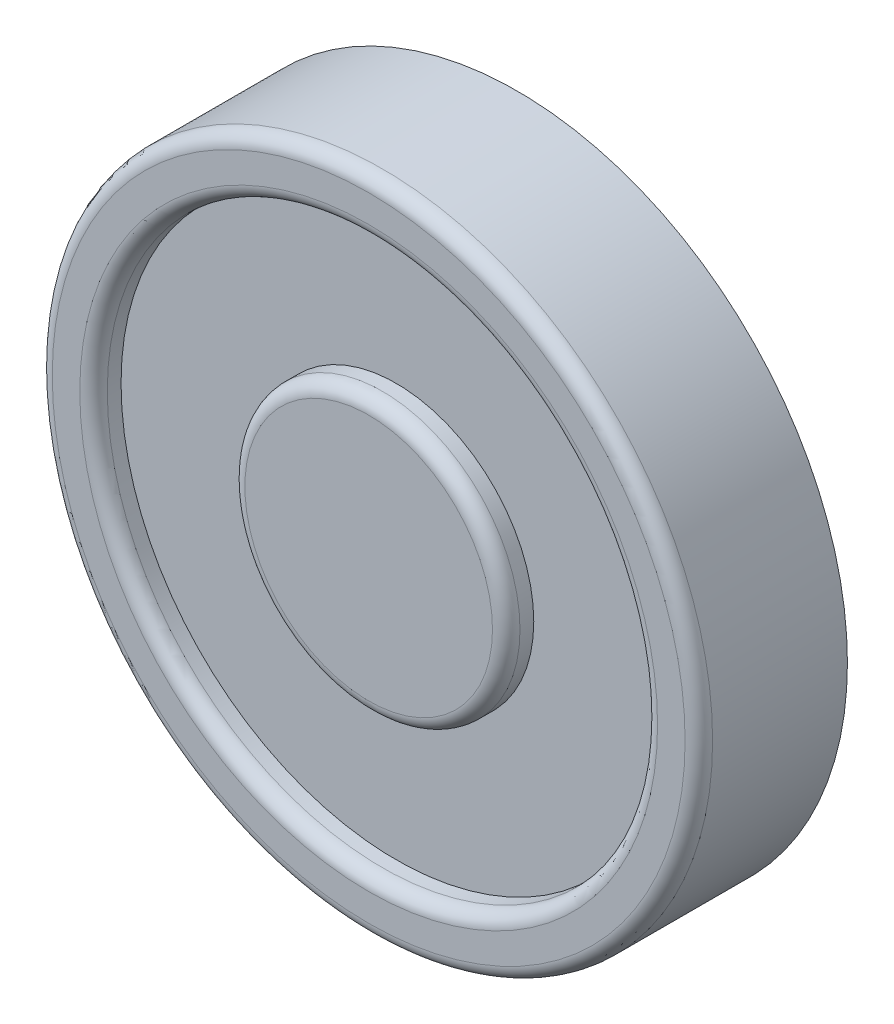
ISO-10303-21;
HEADER;
FILE_DESCRIPTION(('STEP AP214'),'2;1');
FILE_NAME('part.step','',(''),(''),'','','');
FILE_SCHEMA(('AUTOMOTIVE_DESIGN { 1 0 10303 214 1 1 1 1 }'));
ENDSEC;
DATA;
#1=APPLICATION_CONTEXT('core data for automotive mechanical design processes');
#2=APPLICATION_PROTOCOL_DEFINITION('international standard','automotive_design',2000,#1);
#3=PRODUCT_CONTEXT('',#1,'mechanical');
#4=PRODUCT('Part','Part','',(#3));
#5=PRODUCT_RELATED_PRODUCT_CATEGORY('part','',(#4));
#6=PRODUCT_DEFINITION_FORMATION('','',#4);
#7=PRODUCT_DEFINITION_CONTEXT('part definition',#1,'design');
#8=PRODUCT_DEFINITION('design','',#6,#7);
#9=PRODUCT_DEFINITION_SHAPE('','',#8);
#10=(LENGTH_UNIT() NAMED_UNIT(*) SI_UNIT(.MILLI.,.METRE.));
#11=(NAMED_UNIT(*) PLANE_ANGLE_UNIT() SI_UNIT($,.RADIAN.));
#12=(NAMED_UNIT(*) SI_UNIT($,.STERADIAN.) SOLID_ANGLE_UNIT());
#13=UNCERTAINTY_MEASURE_WITH_UNIT(LENGTH_MEASURE(1.E-05),#10,'distance_accuracy_value','');
#14=(GEOMETRIC_REPRESENTATION_CONTEXT(3) GLOBAL_UNCERTAINTY_ASSIGNED_CONTEXT((#13)) GLOBAL_UNIT_ASSIGNED_CONTEXT((#10,
#11,#12)) REPRESENTATION_CONTEXT('',''));
#15=CARTESIAN_POINT('',(0.,0.,0.));
#16=DIRECTION('',(0.,0.,1.));
#17=DIRECTION('',(1.,0.,0.));
#18=AXIS2_PLACEMENT_3D('',#15,#16,#17);
#19=CARTESIAN_POINT('',(-2.62789909595795,3.37216422453345,1.08));
#20=DIRECTION('',(0.,0.,-1.));
#21=DIRECTION('',(-1.,0.,0.));
#22=AXIS2_PLACEMENT_3D('',#19,#20,#21);
#23=CYLINDRICAL_SURFACE('',#22,2.4);
#24=CARTESIAN_POINT('',(-2.62789909595795,3.37216422453345,0.98));
#25=DIRECTION('',(0.,0.,1.));
#26=DIRECTION('',(1.,0.,0.));
#27=AXIS2_PLACEMENT_3D('',#24,#25,#26);
#28=CIRCLE('',#27,2.4);
#29=CARTESIAN_POINT('',(-0.227899095957949,3.37216422453345,0.98));
#30=VERTEX_POINT('',#29);
#31=EDGE_CURVE('E39',#30,#30,#28,.F.);
#32=ORIENTED_EDGE('',*,*,#31,.T.);
#33=EDGE_LOOP('',(#32));
#34=FACE_BOUND('',#33,.T.);
#35=CARTESIAN_POINT('',(-2.62789909595795,3.37216422453345,0.));
#36=DIRECTION('',(0.,0.,1.));
#37=DIRECTION('',(1.,0.,0.));
#38=AXIS2_PLACEMENT_3D('',#35,#36,#37);
#39=CIRCLE('',#38,2.4);
#40=CARTESIAN_POINT('',(-0.227899095957949,3.37216422453345,0.));
#41=VERTEX_POINT('',#40);
#42=EDGE_CURVE('E58',#41,#41,#39,.T.);
#43=ORIENTED_EDGE('',*,*,#42,.T.);
#44=EDGE_LOOP('',(#43));
#45=FACE_BOUND('',#44,.T.);
#46=ADVANCED_FACE('F32',(#34,#45),#23,.T.);
#47=CARTESIAN_POINT('',(-2.62789909595795,3.37216422453345,1.08));
#48=DIRECTION('',(0.,0.,1.));
#49=DIRECTION('',(1.,0.,0.));
#50=AXIS2_PLACEMENT_3D('',#47,#48,#49);
#51=PLANE('',#50);
#52=CARTESIAN_POINT('',(-2.62789909595795,3.37216422453345,1.08));
#53=DIRECTION('',(0.,0.,1.));
#54=DIRECTION('',(1.,0.,0.));
#55=AXIS2_PLACEMENT_3D('',#52,#53,#54);
#56=CIRCLE('',#55,2.3);
#57=CARTESIAN_POINT('',(-0.327899095957949,3.37216422453345,1.08));
#58=VERTEX_POINT('',#57);
#59=EDGE_CURVE('E43',#58,#58,#56,.T.);
#60=ORIENTED_EDGE('',*,*,#59,.T.);
#61=EDGE_LOOP('',(#60));
#62=FACE_BOUND('',#61,.T.);
#63=CARTESIAN_POINT('',(-2.62789909595795,3.37216422453345,1.08));
#64=DIRECTION('',(0.,0.,1.));
#65=DIRECTION('',(1.,0.,0.));
#66=AXIS2_PLACEMENT_3D('',#63,#64,#65);
#67=CIRCLE('',#66,2.1);
#68=CARTESIAN_POINT('',(-0.527899095957949,3.37216422453345,1.08));
#69=VERTEX_POINT('',#68);
#70=EDGE_CURVE('E47',#69,#69,#67,.F.);
#71=ORIENTED_EDGE('',*,*,#70,.T.);
#72=EDGE_LOOP('',(#71));
#73=FACE_BOUND('',#72,.T.);
#74=ADVANCED_FACE('F86',(#62,#73),#51,.T.);
#75=CARTESIAN_POINT('',(-2.62789909595795,3.37216422453345,0.));
#76=DIRECTION('',(0.,0.,1.));
#77=DIRECTION('',(1.,0.,0.));
#78=AXIS2_PLACEMENT_3D('',#75,#76,#77);
#79=PLANE('',#78);
#80=CARTESIAN_POINT('',(-2.62789909595795,3.37216422453345,0.));
#81=DIRECTION('',(0.,0.,-1.));
#82=DIRECTION('',(-1.,0.,0.));
#83=AXIS2_PLACEMENT_3D('',#80,#81,#82);
#84=CIRCLE('',#83,0.5);
#85=CARTESIAN_POINT('',(-3.12789909595795,3.37216422453345,0.));
#86=VERTEX_POINT('',#85);
#87=EDGE_CURVE('E68',#86,#86,#84,.T.);
#88=ORIENTED_EDGE('',*,*,#87,.F.);
#89=EDGE_LOOP('',(#88));
#90=FACE_BOUND('',#89,.T.);
#91=ORIENTED_EDGE('',*,*,#42,.F.);
#92=EDGE_LOOP('',(#91));
#93=FACE_BOUND('',#92,.T.);
#94=ADVANCED_FACE('F82',(#90,#93),#79,.F.);
#95=CARTESIAN_POINT('',(-2.62789909595795,3.37216422453345,0.88));
#96=DIRECTION('',(0.,0.,1.));
#97=DIRECTION('',(1.,0.,0.));
#98=AXIS2_PLACEMENT_3D('',#95,#96,#97);
#99=CYLINDRICAL_SURFACE('',#98,2.);
#100=CARTESIAN_POINT('',(-2.62789909595795,3.37216422453345,0.98));
#101=DIRECTION('',(0.,0.,1.));
#102=DIRECTION('',(1.,0.,0.));
#103=AXIS2_PLACEMENT_3D('',#100,#101,#102);
#104=CIRCLE('',#103,2.);
#105=CARTESIAN_POINT('',(-0.627899095957949,3.37216422453345,0.98));
#106=VERTEX_POINT('',#105);
#107=EDGE_CURVE('E10',#106,#106,#104,.T.);
#108=ORIENTED_EDGE('',*,*,#107,.T.);
#109=EDGE_LOOP('',(#108));
#110=FACE_BOUND('',#109,.T.);
#111=CARTESIAN_POINT('',(-2.62789909595795,3.37216422453345,0.88));
#112=DIRECTION('',(0.,0.,1.));
#113=DIRECTION('',(1.,0.,0.));
#114=AXIS2_PLACEMENT_3D('',#111,#112,#113);
#115=CIRCLE('',#114,2.);
#116=CARTESIAN_POINT('',(-0.627899095957949,3.37216422453345,0.88));
#117=VERTEX_POINT('',#116);
#118=EDGE_CURVE('E61',#117,#117,#115,.T.);
#119=ORIENTED_EDGE('',*,*,#118,.F.);
#120=EDGE_LOOP('',(#119));
#121=FACE_BOUND('',#120,.T.);
#122=ADVANCED_FACE('F85',(#110,#121),#99,.F.);
#123=CARTESIAN_POINT('',(-2.62789909595795,3.37216422453345,0.88));
#124=DIRECTION('',(0.,0.,1.));
#125=DIRECTION('',(1.,0.,0.));
#126=AXIS2_PLACEMENT_3D('',#123,#124,#125);
#127=PLANE('',#126);
#128=CARTESIAN_POINT('',(-2.62789909595795,3.37216422453345,0.88));
#129=DIRECTION('',(0.,0.,1.));
#130=DIRECTION('',(1.,0.,0.));
#131=AXIS2_PLACEMENT_3D('',#128,#129,#130);
#132=CIRCLE('',#131,1.);
#133=CARTESIAN_POINT('',(-1.62789909595795,3.37216422453345,0.88));
#134=VERTEX_POINT('',#133);
#135=EDGE_CURVE('E64',#134,#134,#132,.T.);
#136=ORIENTED_EDGE('',*,*,#135,.F.);
#137=EDGE_LOOP('',(#136));
#138=FACE_BOUND('',#137,.T.);
#139=ORIENTED_EDGE('',*,*,#118,.T.);
#140=EDGE_LOOP('',(#139));
#141=FACE_BOUND('',#140,.T.);
#142=ADVANCED_FACE('F152',(#138,#141),#127,.T.);
#143=CARTESIAN_POINT('',(-2.62789909595795,3.37216422453345,0.88));
#144=DIRECTION('',(0.,0.,1.));
#145=DIRECTION('',(1.,0.,0.));
#146=AXIS2_PLACEMENT_3D('',#143,#144,#145);
#147=CYLINDRICAL_SURFACE('',#146,1.);
#148=CARTESIAN_POINT('',(-2.62789909595795,3.37216422453345,0.98));
#149=DIRECTION('',(0.,0.,1.));
#150=DIRECTION('',(1.,0.,0.));
#151=AXIS2_PLACEMENT_3D('',#148,#149,#150);
#152=CIRCLE('',#151,1.);
#153=CARTESIAN_POINT('',(-1.62789909595795,3.37216422453345,0.98));
#154=VERTEX_POINT('',#153);
#155=EDGE_CURVE('E52',#154,#154,#152,.F.);
#156=ORIENTED_EDGE('',*,*,#155,.T.);
#157=EDGE_LOOP('',(#156));
#158=FACE_BOUND('',#157,.T.);
#159=ORIENTED_EDGE('',*,*,#135,.T.);
#160=EDGE_LOOP('',(#159));
#161=FACE_BOUND('',#160,.T.);
#162=ADVANCED_FACE('F146',(#158,#161),#147,.T.);
#163=CARTESIAN_POINT('',(-2.62789909595795,3.37216422453345,1.08));
#164=DIRECTION('',(0.,0.,1.));
#165=DIRECTION('',(1.,0.,0.));
#166=AXIS2_PLACEMENT_3D('',#163,#164,#165);
#167=CIRCLE('',#166,0.9);
#168=CARTESIAN_POINT('',(-1.72789909595795,3.37216422453345,1.08));
#169=VERTEX_POINT('',#168);
#170=EDGE_CURVE('E55',#169,#169,#167,.T.);
#171=ORIENTED_EDGE('',*,*,#170,.T.);
#172=EDGE_LOOP('',(#171));
#173=FACE_BOUND('',#172,.T.);
#174=ADVANCED_FACE('F97',(#173),#51,.T.);
#175=CARTESIAN_POINT('',(-2.62789909595795,3.37216422453345,0.98));
#176=DIRECTION('',(0.,0.,1.));
#177=DIRECTION('',(1.,0.,0.));
#178=AXIS2_PLACEMENT_3D('',#175,#176,#177);
#179=TOROIDAL_SURFACE('',#178,0.9,0.1);
#180=ORIENTED_EDGE('',*,*,#155,.F.);
#181=EDGE_LOOP('',(#180));
#182=FACE_BOUND('',#181,.T.);
#183=ORIENTED_EDGE('',*,*,#170,.F.);
#184=EDGE_LOOP('',(#183));
#185=FACE_BOUND('',#184,.T.);
#186=ADVANCED_FACE('F99',(#182,#185),#179,.T.);
#187=CARTESIAN_POINT('',(-2.62789909595795,3.37216422453345,0.98));
#188=DIRECTION('',(0.,0.,1.));
#189=DIRECTION('',(1.,0.,0.));
#190=AXIS2_PLACEMENT_3D('',#187,#188,#189);
#191=TOROIDAL_SURFACE('',#190,2.3,0.1);
#192=ORIENTED_EDGE('',*,*,#31,.F.);
#193=EDGE_LOOP('',(#192));
#194=FACE_BOUND('',#193,.T.);
#195=ORIENTED_EDGE('',*,*,#59,.F.);
#196=EDGE_LOOP('',(#195));
#197=FACE_BOUND('',#196,.T.);
#198=ADVANCED_FACE('F101',(#194,#197),#191,.T.);
#199=CARTESIAN_POINT('',(-2.62789909595795,3.37216422453345,0.98));
#200=DIRECTION('',(0.,0.,1.));
#201=DIRECTION('',(1.,0.,0.));
#202=AXIS2_PLACEMENT_3D('',#199,#200,#201);
#203=TOROIDAL_SURFACE('',#202,2.1,0.1);
#204=ORIENTED_EDGE('',*,*,#70,.F.);
#205=EDGE_LOOP('',(#204));
#206=FACE_BOUND('',#205,.T.);
#207=ORIENTED_EDGE('',*,*,#107,.F.);
#208=EDGE_LOOP('',(#207));
#209=FACE_BOUND('',#208,.T.);
#210=ADVANCED_FACE('F34',(#206,#209),#203,.T.);
#211=CARTESIAN_POINT('',(-2.62789909595795,3.37216422453345,0.2));
#212=DIRECTION('',(0.,0.,-1.));
#213=DIRECTION('',(-1.,0.,0.));
#214=AXIS2_PLACEMENT_3D('',#211,#212,#213);
#215=CYLINDRICAL_SURFACE('',#214,0.5);
#216=CARTESIAN_POINT('',(-2.62789909595795,3.37216422453345,0.2));
#217=DIRECTION('',(0.,0.,-1.));
#218=DIRECTION('',(-1.,0.,0.));
#219=AXIS2_PLACEMENT_3D('',#216,#217,#218);
#220=CIRCLE('',#219,0.5);
#221=CARTESIAN_POINT('',(-3.12789909595795,3.37216422453345,0.2));
#222=VERTEX_POINT('',#221);
#223=EDGE_CURVE('E67',#222,#222,#220,.T.);
#224=ORIENTED_EDGE('',*,*,#223,.F.);
#225=EDGE_LOOP('',(#224));
#226=FACE_BOUND('',#225,.T.);
#227=ORIENTED_EDGE('',*,*,#87,.T.);
#228=EDGE_LOOP('',(#227));
#229=FACE_BOUND('',#228,.T.);
#230=ADVANCED_FACE('F76',(#226,#229),#215,.F.);
#231=CARTESIAN_POINT('',(-2.62789909595795,3.37216422453345,0.2));
#232=DIRECTION('',(0.,0.,-1.));
#233=DIRECTION('',(-1.,0.,0.));
#234=AXIS2_PLACEMENT_3D('',#231,#232,#233);
#235=PLANE('',#234);
#236=ORIENTED_EDGE('',*,*,#223,.T.);
#237=EDGE_LOOP('',(#236));
#238=FACE_BOUND('',#237,.T.);
#239=ADVANCED_FACE('F74',(#238),#235,.T.);
#240=CLOSED_SHELL('',(#46,#74,#94,#122,#142,#162,#174,#186,#198,#210,#230,#239));
#241=MANIFOLD_SOLID_BREP('B2',#240);
#242=ADVANCED_BREP_SHAPE_REPRESENTATION('',(#18,#241),#14);
#243=SHAPE_DEFINITION_REPRESENTATION(#9,#242);
ENDSEC;
END-ISO-10303-21;
